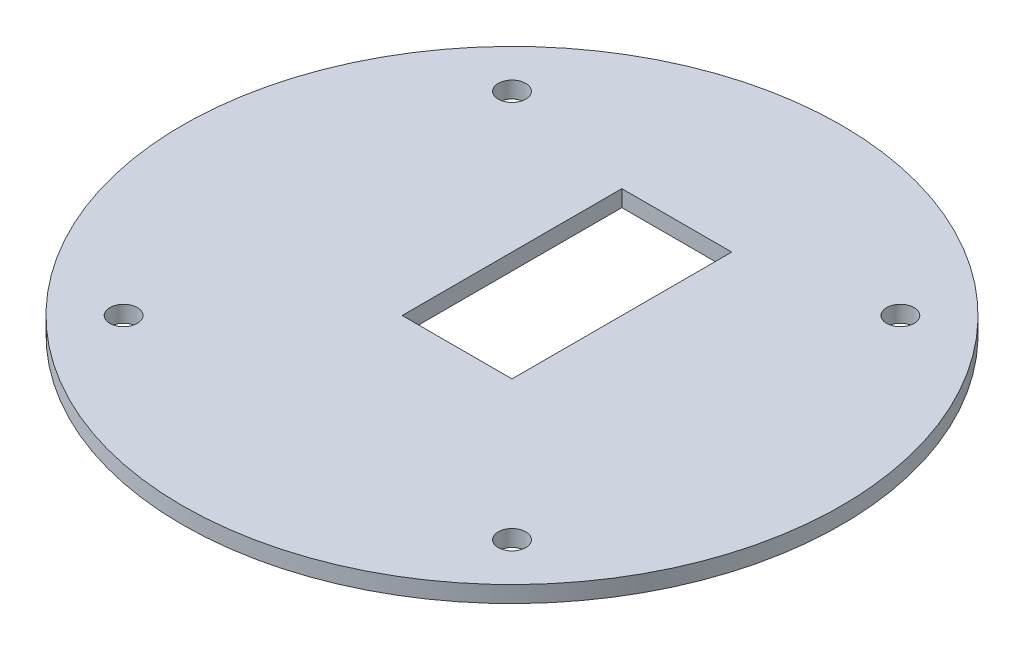
ISO-10303-21;
HEADER;
FILE_DESCRIPTION(('STEP AP214'),'2;1');
FILE_NAME('part.step','',(''),(''),'','','');
FILE_SCHEMA(('AUTOMOTIVE_DESIGN { 1 0 10303 214 1 1 1 1 }'));
ENDSEC;
DATA;
#1=APPLICATION_CONTEXT('core data for automotive mechanical design processes');
#2=APPLICATION_PROTOCOL_DEFINITION('international standard','automotive_design',2000,#1);
#3=PRODUCT_CONTEXT('',#1,'mechanical');
#4=PRODUCT('Part','Part','',(#3));
#5=PRODUCT_RELATED_PRODUCT_CATEGORY('part','',(#4));
#6=PRODUCT_DEFINITION_FORMATION('','',#4);
#7=PRODUCT_DEFINITION_CONTEXT('part definition',#1,'design');
#8=PRODUCT_DEFINITION('design','',#6,#7);
#9=PRODUCT_DEFINITION_SHAPE('','',#8);
#10=(LENGTH_UNIT() NAMED_UNIT(*) SI_UNIT(.MILLI.,.METRE.));
#11=(NAMED_UNIT(*) PLANE_ANGLE_UNIT() SI_UNIT($,.RADIAN.));
#12=(NAMED_UNIT(*) SI_UNIT($,.STERADIAN.) SOLID_ANGLE_UNIT());
#13=UNCERTAINTY_MEASURE_WITH_UNIT(LENGTH_MEASURE(1.E-05),#10,'distance_accuracy_value','');
#14=(GEOMETRIC_REPRESENTATION_CONTEXT(3) GLOBAL_UNCERTAINTY_ASSIGNED_CONTEXT((#13)) GLOBAL_UNIT_ASSIGNED_CONTEXT((#10,
#11,#12)) REPRESENTATION_CONTEXT('',''));
#15=CARTESIAN_POINT('',(0.,0.,0.));
#16=DIRECTION('',(0.,0.,1.));
#17=DIRECTION('',(1.,0.,0.));
#18=AXIS2_PLACEMENT_3D('',#15,#16,#17);
#19=CARTESIAN_POINT('',(0.,3.,0.));
#20=DIRECTION('',(0.,1.,0.));
#21=DIRECTION('',(0.,0.,1.));
#22=AXIS2_PLACEMENT_3D('',#19,#20,#21);
#23=PLANE('',#22);
#24=CARTESIAN_POINT('',(35.3553390593295,3.,35.3553390593281));
#25=DIRECTION('',(0.,1.,0.));
#26=DIRECTION('',(0.,0.,1.));
#27=AXIS2_PLACEMENT_3D('',#24,#25,#26);
#28=CIRCLE('',#27,2.5);
#29=CARTESIAN_POINT('',(35.3553390593295,3.,37.8553390593281));
#30=VERTEX_POINT('',#29);
#31=EDGE_CURVE('E208',#30,#30,#28,.T.);
#32=ORIENTED_EDGE('',*,*,#31,.F.);
#33=EDGE_LOOP('',(#32));
#34=FACE_BOUND('',#33,.T.);
#35=CARTESIAN_POINT('',(-35.3553390593267,3.,-35.3553390593281));
#36=DIRECTION('',(0.,1.,0.));
#37=DIRECTION('',(0.,0.,1.));
#38=AXIS2_PLACEMENT_3D('',#35,#36,#37);
#39=CIRCLE('',#38,2.5);
#40=CARTESIAN_POINT('',(-35.3553390593267,3.,-32.8553390593281));
#41=VERTEX_POINT('',#40);
#42=EDGE_CURVE('E104',#41,#41,#39,.T.);
#43=ORIENTED_EDGE('',*,*,#42,.F.);
#44=EDGE_LOOP('',(#43));
#45=FACE_BOUND('',#44,.T.);
#46=CARTESIAN_POINT('',(0.,3.,0.));
#47=DIRECTION('',(0.,1.,0.));
#48=DIRECTION('',(0.,0.,1.));
#49=AXIS2_PLACEMENT_3D('',#46,#47,#48);
#50=CIRCLE('',#49,60.);
#51=CARTESIAN_POINT('',(0.,3.,60.));
#52=VERTEX_POINT('',#51);
#53=EDGE_CURVE('E11',#52,#52,#50,.T.);
#54=ORIENTED_EDGE('',*,*,#53,.T.);
#55=EDGE_LOOP('',(#54));
#56=FACE_BOUND('',#55,.T.);
#57=DIRECTION('',(1.,0.,0.));
#58=VECTOR('',#57,1.);
#59=CARTESIAN_POINT('',(10.,3.,10.));
#60=LINE('',#59,#58);
#61=CARTESIAN_POINT('',(-10.,3.,10.));
#62=VERTEX_POINT('',#61);
#63=CARTESIAN_POINT('',(10.,3.,10.));
#64=VERTEX_POINT('',#63);
#65=EDGE_CURVE('E84',#62,#64,#60,.T.);
#66=ORIENTED_EDGE('',*,*,#65,.F.);
#67=DIRECTION('',(0.,0.,1.));
#68=VECTOR('',#67,1.);
#69=CARTESIAN_POINT('',(-10.,3.,-30.));
#70=LINE('',#69,#68);
#71=CARTESIAN_POINT('',(-10.,3.,-30.));
#72=VERTEX_POINT('',#71);
#73=EDGE_CURVE('E76',#72,#62,#70,.T.);
#74=ORIENTED_EDGE('',*,*,#73,.F.);
#75=DIRECTION('',(-1.,0.,0.));
#76=VECTOR('',#75,1.);
#77=CARTESIAN_POINT('',(10.,3.,-30.));
#78=LINE('',#77,#76);
#79=CARTESIAN_POINT('',(10.,3.,-30.));
#80=VERTEX_POINT('',#79);
#81=EDGE_CURVE('E98',#80,#72,#78,.T.);
#82=ORIENTED_EDGE('',*,*,#81,.F.);
#83=DIRECTION('',(0.,0.,-1.));
#84=VECTOR('',#83,1.);
#85=CARTESIAN_POINT('',(10.,3.,-30.));
#86=LINE('',#85,#84);
#87=EDGE_CURVE('E96',#64,#80,#86,.T.);
#88=ORIENTED_EDGE('',*,*,#87,.F.);
#89=EDGE_LOOP('',(#66,#74,#82,#88));
#90=FACE_BOUND('',#89,.T.);
#91=CARTESIAN_POINT('',(35.3553390593295,3.,-35.3553390593281));
#92=DIRECTION('',(0.,1.,0.));
#93=DIRECTION('',(0.,0.,1.));
#94=AXIS2_PLACEMENT_3D('',#91,#92,#93);
#95=CIRCLE('',#94,2.5);
#96=CARTESIAN_POINT('',(35.3553390593295,3.,-32.8553390593281));
#97=VERTEX_POINT('',#96);
#98=EDGE_CURVE('E214',#97,#97,#95,.T.);
#99=ORIENTED_EDGE('',*,*,#98,.F.);
#100=EDGE_LOOP('',(#99));
#101=FACE_BOUND('',#100,.T.);
#102=CARTESIAN_POINT('',(-35.3553390593267,3.,35.3553390593281));
#103=DIRECTION('',(0.,1.,0.));
#104=DIRECTION('',(0.,0.,1.));
#105=AXIS2_PLACEMENT_3D('',#102,#103,#104);
#106=CIRCLE('',#105,2.5);
#107=CARTESIAN_POINT('',(-35.3553390593267,3.,37.8553390593281));
#108=VERTEX_POINT('',#107);
#109=EDGE_CURVE('E199',#108,#108,#106,.T.);
#110=ORIENTED_EDGE('',*,*,#109,.F.);
#111=EDGE_LOOP('',(#110));
#112=FACE_BOUND('',#111,.T.);
#113=ADVANCED_FACE('F35',(#34,#45,#56,#90,#101,#112),#23,.T.);
#114=CARTESIAN_POINT('',(0.,0.,0.));
#115=DIRECTION('',(0.,1.,0.));
#116=DIRECTION('',(0.,0.,1.));
#117=AXIS2_PLACEMENT_3D('',#114,#115,#116);
#118=PLANE('',#117);
#119=CARTESIAN_POINT('',(0.,0.,0.));
#120=DIRECTION('',(0.,1.,0.));
#121=DIRECTION('',(0.,0.,1.));
#122=AXIS2_PLACEMENT_3D('',#119,#120,#121);
#123=CIRCLE('',#122,60.);
#124=CARTESIAN_POINT('',(0.,0.,60.));
#125=VERTEX_POINT('',#124);
#126=EDGE_CURVE('E39',#125,#125,#123,.T.);
#127=ORIENTED_EDGE('',*,*,#126,.F.);
#128=EDGE_LOOP('',(#127));
#129=FACE_BOUND('',#128,.T.);
#130=DIRECTION('',(0.,0.,1.));
#131=VECTOR('',#130,1.);
#132=CARTESIAN_POINT('',(-10.,0.,-30.));
#133=LINE('',#132,#131);
#134=CARTESIAN_POINT('',(-10.,0.,-30.));
#135=VERTEX_POINT('',#134);
#136=CARTESIAN_POINT('',(-10.,0.,10.));
#137=VERTEX_POINT('',#136);
#138=EDGE_CURVE('E58',#135,#137,#133,.T.);
#139=ORIENTED_EDGE('',*,*,#138,.T.);
#140=DIRECTION('',(1.,0.,0.));
#141=VECTOR('',#140,1.);
#142=CARTESIAN_POINT('',(10.,0.,10.));
#143=LINE('',#142,#141);
#144=CARTESIAN_POINT('',(10.,0.,10.));
#145=VERTEX_POINT('',#144);
#146=EDGE_CURVE('E91',#137,#145,#143,.T.);
#147=ORIENTED_EDGE('',*,*,#146,.T.);
#148=DIRECTION('',(0.,0.,-1.));
#149=VECTOR('',#148,1.);
#150=CARTESIAN_POINT('',(10.,0.,-30.));
#151=LINE('',#150,#149);
#152=CARTESIAN_POINT('',(10.,0.,-30.));
#153=VERTEX_POINT('',#152);
#154=EDGE_CURVE('E106',#145,#153,#151,.T.);
#155=ORIENTED_EDGE('',*,*,#154,.T.);
#156=DIRECTION('',(-1.,0.,0.));
#157=VECTOR('',#156,1.);
#158=CARTESIAN_POINT('',(10.,0.,-30.));
#159=LINE('',#158,#157);
#160=EDGE_CURVE('E85',#153,#135,#159,.T.);
#161=ORIENTED_EDGE('',*,*,#160,.T.);
#162=EDGE_LOOP('',(#139,#147,#155,#161));
#163=FACE_BOUND('',#162,.T.);
#164=CARTESIAN_POINT('',(-35.3553390593267,0.,-35.3553390593281));
#165=DIRECTION('',(0.,1.,0.));
#166=DIRECTION('',(0.,0.,1.));
#167=AXIS2_PLACEMENT_3D('',#164,#165,#166);
#168=CIRCLE('',#167,2.5);
#169=CARTESIAN_POINT('',(-35.3553390593267,0.,-32.8553390593281));
#170=VERTEX_POINT('',#169);
#171=EDGE_CURVE('E217',#170,#170,#168,.T.);
#172=ORIENTED_EDGE('',*,*,#171,.T.);
#173=EDGE_LOOP('',(#172));
#174=FACE_BOUND('',#173,.T.);
#175=CARTESIAN_POINT('',(35.3553390593295,0.,-35.3553390593281));
#176=DIRECTION('',(0.,1.,0.));
#177=DIRECTION('',(0.,0.,1.));
#178=AXIS2_PLACEMENT_3D('',#175,#176,#177);
#179=CIRCLE('',#178,2.5);
#180=CARTESIAN_POINT('',(35.3553390593295,0.,-32.8553390593281));
#181=VERTEX_POINT('',#180);
#182=EDGE_CURVE('E211',#181,#181,#179,.T.);
#183=ORIENTED_EDGE('',*,*,#182,.T.);
#184=EDGE_LOOP('',(#183));
#185=FACE_BOUND('',#184,.T.);
#186=CARTESIAN_POINT('',(35.3553390593295,0.,35.3553390593281));
#187=DIRECTION('',(0.,1.,0.));
#188=DIRECTION('',(0.,0.,1.));
#189=AXIS2_PLACEMENT_3D('',#186,#187,#188);
#190=CIRCLE('',#189,2.5);
#191=CARTESIAN_POINT('',(35.3553390593295,0.,37.8553390593281));
#192=VERTEX_POINT('',#191);
#193=EDGE_CURVE('E205',#192,#192,#190,.T.);
#194=ORIENTED_EDGE('',*,*,#193,.T.);
#195=EDGE_LOOP('',(#194));
#196=FACE_BOUND('',#195,.T.);
#197=CARTESIAN_POINT('',(-35.3553390593267,0.,35.3553390593281));
#198=DIRECTION('',(0.,1.,0.));
#199=DIRECTION('',(0.,0.,1.));
#200=AXIS2_PLACEMENT_3D('',#197,#198,#199);
#201=CIRCLE('',#200,2.5);
#202=CARTESIAN_POINT('',(-35.3553390593267,0.,37.8553390593281));
#203=VERTEX_POINT('',#202);
#204=EDGE_CURVE('E202',#203,#203,#201,.T.);
#205=ORIENTED_EDGE('',*,*,#204,.T.);
#206=EDGE_LOOP('',(#205));
#207=FACE_BOUND('',#206,.T.);
#208=ADVANCED_FACE('F117',(#129,#163,#174,#185,#196,#207),#118,.F.);
#209=CARTESIAN_POINT('',(0.,3.,0.));
#210=DIRECTION('',(0.,-1.,0.));
#211=DIRECTION('',(0.,0.,-1.));
#212=AXIS2_PLACEMENT_3D('',#209,#210,#211);
#213=CYLINDRICAL_SURFACE('',#212,60.);
#214=ORIENTED_EDGE('',*,*,#53,.F.);
#215=EDGE_LOOP('',(#214));
#216=FACE_BOUND('',#215,.T.);
#217=ORIENTED_EDGE('',*,*,#126,.T.);
#218=EDGE_LOOP('',(#217));
#219=FACE_BOUND('',#218,.T.);
#220=ADVANCED_FACE('F37',(#216,#219),#213,.T.);
#221=CARTESIAN_POINT('',(-10.,3.,-30.));
#222=DIRECTION('',(1.,0.,0.));
#223=DIRECTION('',(0.,0.,-1.));
#224=AXIS2_PLACEMENT_3D('',#221,#222,#223);
#225=PLANE('',#224);
#226=ORIENTED_EDGE('',*,*,#138,.F.);
#227=DIRECTION('',(0.,-1.,0.));
#228=VECTOR('',#227,1.);
#229=CARTESIAN_POINT('',(-10.,3.,-30.));
#230=LINE('',#229,#228);
#231=EDGE_CURVE('E80',#72,#135,#230,.T.);
#232=ORIENTED_EDGE('',*,*,#231,.F.);
#233=ORIENTED_EDGE('',*,*,#73,.T.);
#234=DIRECTION('',(0.,-1.,0.));
#235=VECTOR('',#234,1.);
#236=CARTESIAN_POINT('',(-10.,3.,10.));
#237=LINE('',#236,#235);
#238=EDGE_CURVE('E79',#62,#137,#237,.T.);
#239=ORIENTED_EDGE('',*,*,#238,.T.);
#240=EDGE_LOOP('',(#226,#232,#233,#239));
#241=FACE_BOUND('',#240,.T.);
#242=ADVANCED_FACE('F78',(#241),#225,.T.);
#243=CARTESIAN_POINT('',(10.,3.,10.));
#244=DIRECTION('',(0.,0.,-1.));
#245=DIRECTION('',(-1.,0.,0.));
#246=AXIS2_PLACEMENT_3D('',#243,#244,#245);
#247=PLANE('',#246);
#248=ORIENTED_EDGE('',*,*,#146,.F.);
#249=ORIENTED_EDGE('',*,*,#238,.F.);
#250=ORIENTED_EDGE('',*,*,#65,.T.);
#251=DIRECTION('',(0.,-1.,0.));
#252=VECTOR('',#251,1.);
#253=CARTESIAN_POINT('',(10.,3.,10.));
#254=LINE('',#253,#252);
#255=EDGE_CURVE('E92',#64,#145,#254,.T.);
#256=ORIENTED_EDGE('',*,*,#255,.T.);
#257=EDGE_LOOP('',(#248,#249,#250,#256));
#258=FACE_BOUND('',#257,.T.);
#259=ADVANCED_FACE('F88',(#258),#247,.T.);
#260=CARTESIAN_POINT('',(10.,3.,-30.));
#261=DIRECTION('',(-1.,0.,0.));
#262=DIRECTION('',(0.,0.,1.));
#263=AXIS2_PLACEMENT_3D('',#260,#261,#262);
#264=PLANE('',#263);
#265=ORIENTED_EDGE('',*,*,#154,.F.);
#266=ORIENTED_EDGE('',*,*,#255,.F.);
#267=ORIENTED_EDGE('',*,*,#87,.T.);
#268=DIRECTION('',(0.,-1.,0.));
#269=VECTOR('',#268,1.);
#270=CARTESIAN_POINT('',(10.,3.,-30.));
#271=LINE('',#270,#269);
#272=EDGE_CURVE('E50',#80,#153,#271,.T.);
#273=ORIENTED_EDGE('',*,*,#272,.T.);
#274=EDGE_LOOP('',(#265,#266,#267,#273));
#275=FACE_BOUND('',#274,.T.);
#276=ADVANCED_FACE('F115',(#275),#264,.T.);
#277=CARTESIAN_POINT('',(10.,3.,-30.));
#278=DIRECTION('',(0.,0.,1.));
#279=DIRECTION('',(1.,0.,0.));
#280=AXIS2_PLACEMENT_3D('',#277,#278,#279);
#281=PLANE('',#280);
#282=ORIENTED_EDGE('',*,*,#160,.F.);
#283=ORIENTED_EDGE('',*,*,#272,.F.);
#284=ORIENTED_EDGE('',*,*,#81,.T.);
#285=ORIENTED_EDGE('',*,*,#231,.T.);
#286=EDGE_LOOP('',(#282,#283,#284,#285));
#287=FACE_BOUND('',#286,.T.);
#288=ADVANCED_FACE('F119',(#287),#281,.T.);
#289=CARTESIAN_POINT('',(-35.3553390593267,3.,-35.3553390593281));
#290=DIRECTION('',(0.,-1.,0.));
#291=DIRECTION('',(0.,0.,-1.));
#292=AXIS2_PLACEMENT_3D('',#289,#290,#291);
#293=CYLINDRICAL_SURFACE('',#292,2.5);
#294=ORIENTED_EDGE('',*,*,#42,.T.);
#295=EDGE_LOOP('',(#294));
#296=FACE_BOUND('',#295,.T.);
#297=ORIENTED_EDGE('',*,*,#171,.F.);
#298=EDGE_LOOP('',(#297));
#299=FACE_BOUND('',#298,.T.);
#300=ADVANCED_FACE('F121',(#296,#299),#293,.F.);
#301=CARTESIAN_POINT('',(35.3553390593295,3.,-35.3553390593281));
#302=DIRECTION('',(0.,-1.,0.));
#303=DIRECTION('',(0.,0.,-1.));
#304=AXIS2_PLACEMENT_3D('',#301,#302,#303);
#305=CYLINDRICAL_SURFACE('',#304,2.5);
#306=ORIENTED_EDGE('',*,*,#98,.T.);
#307=EDGE_LOOP('',(#306));
#308=FACE_BOUND('',#307,.T.);
#309=ORIENTED_EDGE('',*,*,#182,.F.);
#310=EDGE_LOOP('',(#309));
#311=FACE_BOUND('',#310,.T.);
#312=ADVANCED_FACE('F127',(#308,#311),#305,.F.);
#313=CARTESIAN_POINT('',(35.3553390593295,3.,35.3553390593281));
#314=DIRECTION('',(0.,-1.,0.));
#315=DIRECTION('',(0.,0.,-1.));
#316=AXIS2_PLACEMENT_3D('',#313,#314,#315);
#317=CYLINDRICAL_SURFACE('',#316,2.5);
#318=ORIENTED_EDGE('',*,*,#31,.T.);
#319=EDGE_LOOP('',(#318));
#320=FACE_BOUND('',#319,.T.);
#321=ORIENTED_EDGE('',*,*,#193,.F.);
#322=EDGE_LOOP('',(#321));
#323=FACE_BOUND('',#322,.T.);
#324=ADVANCED_FACE('F172',(#320,#323),#317,.F.);
#325=CARTESIAN_POINT('',(-35.3553390593267,3.,35.3553390593281));
#326=DIRECTION('',(0.,-1.,0.));
#327=DIRECTION('',(0.,0.,-1.));
#328=AXIS2_PLACEMENT_3D('',#325,#326,#327);
#329=CYLINDRICAL_SURFACE('',#328,2.5);
#330=ORIENTED_EDGE('',*,*,#109,.T.);
#331=EDGE_LOOP('',(#330));
#332=FACE_BOUND('',#331,.T.);
#333=ORIENTED_EDGE('',*,*,#204,.F.);
#334=EDGE_LOOP('',(#333));
#335=FACE_BOUND('',#334,.T.);
#336=ADVANCED_FACE('F182',(#332,#335),#329,.F.);
#337=CLOSED_SHELL('',(#113,#208,#220,#242,#259,#276,#288,#300,#312,#324,#336));
#338=MANIFOLD_SOLID_BREP('B2',#337);
#339=ADVANCED_BREP_SHAPE_REPRESENTATION('',(#18,#338),#14);
#340=SHAPE_DEFINITION_REPRESENTATION(#9,#339);
ENDSEC;
END-ISO-10303-21;
